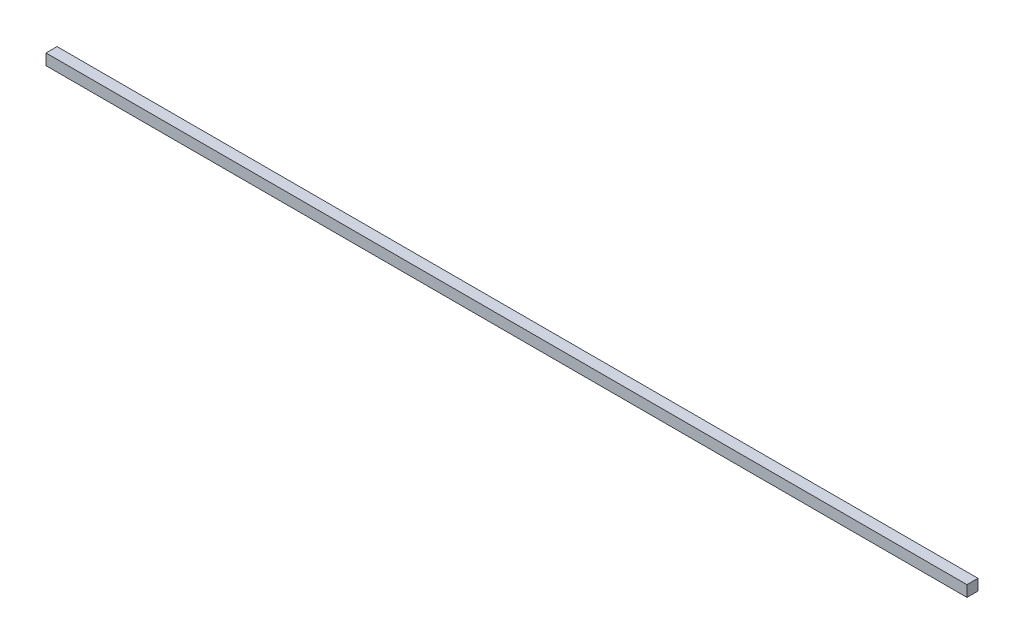
ISO-10303-21;
HEADER;
FILE_DESCRIPTION(('STEP AP214'),'2;1');
FILE_NAME('part.step','',(''),(''),'','','');
FILE_SCHEMA(('AUTOMOTIVE_DESIGN { 1 0 10303 214 1 1 1 1 }'));
ENDSEC;
DATA;
#1=APPLICATION_CONTEXT('core data for automotive mechanical design processes');
#2=APPLICATION_PROTOCOL_DEFINITION('international standard','automotive_design',2000,#1);
#3=PRODUCT_CONTEXT('',#1,'mechanical');
#4=PRODUCT('Part','Part','',(#3));
#5=PRODUCT_RELATED_PRODUCT_CATEGORY('part','',(#4));
#6=PRODUCT_DEFINITION_FORMATION('','',#4);
#7=PRODUCT_DEFINITION_CONTEXT('part definition',#1,'design');
#8=PRODUCT_DEFINITION('design','',#6,#7);
#9=PRODUCT_DEFINITION_SHAPE('','',#8);
#10=(LENGTH_UNIT() NAMED_UNIT(*) SI_UNIT(.MILLI.,.METRE.));
#11=(NAMED_UNIT(*) PLANE_ANGLE_UNIT() SI_UNIT($,.RADIAN.));
#12=(NAMED_UNIT(*) SI_UNIT($,.STERADIAN.) SOLID_ANGLE_UNIT());
#13=UNCERTAINTY_MEASURE_WITH_UNIT(LENGTH_MEASURE(1.E-05),#10,'distance_accuracy_value','');
#14=(GEOMETRIC_REPRESENTATION_CONTEXT(3) GLOBAL_UNCERTAINTY_ASSIGNED_CONTEXT((#13)) GLOBAL_UNIT_ASSIGNED_CONTEXT((#10,
#11,#12)) REPRESENTATION_CONTEXT('',''));
#15=CARTESIAN_POINT('',(0.,0.,0.));
#16=DIRECTION('',(0.,0.,1.));
#17=DIRECTION('',(1.,0.,0.));
#18=AXIS2_PLACEMENT_3D('',#15,#16,#17);
#19=CARTESIAN_POINT('',(2502.,15.,-15.));
#20=DIRECTION('',(0.,0.,1.));
#21=DIRECTION('',(1.,0.,0.));
#22=AXIS2_PLACEMENT_3D('',#19,#20,#21);
#23=PLANE('',#22);
#24=DIRECTION('',(0.,1.,0.));
#25=VECTOR('',#24,1.);
#26=CARTESIAN_POINT('',(0.,15.,-15.));
#27=LINE('',#26,#25);
#28=CARTESIAN_POINT('',(0.,-15.,-15.));
#29=VERTEX_POINT('',#28);
#30=CARTESIAN_POINT('',(0.,15.,-15.));
#31=VERTEX_POINT('',#30);
#32=EDGE_CURVE('E107',#29,#31,#27,.T.);
#33=ORIENTED_EDGE('',*,*,#32,.T.);
#34=DIRECTION('',(-1.,0.,0.));
#35=VECTOR('',#34,1.);
#36=CARTESIAN_POINT('',(2502.,15.,-15.));
#37=LINE('',#36,#35);
#38=CARTESIAN_POINT('',(2502.,15.,-15.));
#39=VERTEX_POINT('',#38);
#40=EDGE_CURVE('E11',#39,#31,#37,.T.);
#41=ORIENTED_EDGE('',*,*,#40,.F.);
#42=DIRECTION('',(0.,1.,0.));
#43=VECTOR('',#42,1.);
#44=CARTESIAN_POINT('',(2502.,15.,-15.));
#45=LINE('',#44,#43);
#46=CARTESIAN_POINT('',(2502.,-15.,-15.));
#47=VERTEX_POINT('',#46);
#48=EDGE_CURVE('E91',#47,#39,#45,.T.);
#49=ORIENTED_EDGE('',*,*,#48,.F.);
#50=DIRECTION('',(-1.,0.,0.));
#51=VECTOR('',#50,1.);
#52=CARTESIAN_POINT('',(2502.,-15.,-15.));
#53=LINE('',#52,#51);
#54=EDGE_CURVE('E103',#47,#29,#53,.T.);
#55=ORIENTED_EDGE('',*,*,#54,.T.);
#56=EDGE_LOOP('',(#33,#41,#49,#55));
#57=FACE_BOUND('',#56,.T.);
#58=ADVANCED_FACE('F39',(#57),#23,.F.);
#59=CARTESIAN_POINT('',(2502.,15.,15.));
#60=DIRECTION('',(0.,-1.,0.));
#61=DIRECTION('',(0.,0.,-1.));
#62=AXIS2_PLACEMENT_3D('',#59,#60,#61);
#63=PLANE('',#62);
#64=DIRECTION('',(0.,0.,1.));
#65=VECTOR('',#64,1.);
#66=CARTESIAN_POINT('',(0.,15.,15.));
#67=LINE('',#66,#65);
#68=CARTESIAN_POINT('',(0.,15.,15.));
#69=VERTEX_POINT('',#68);
#70=EDGE_CURVE('E96',#31,#69,#67,.T.);
#71=ORIENTED_EDGE('',*,*,#70,.T.);
#72=DIRECTION('',(-1.,0.,0.));
#73=VECTOR('',#72,1.);
#74=CARTESIAN_POINT('',(2502.,15.,15.));
#75=LINE('',#74,#73);
#76=CARTESIAN_POINT('',(2502.,15.,15.));
#77=VERTEX_POINT('',#76);
#78=EDGE_CURVE('E48',#77,#69,#75,.T.);
#79=ORIENTED_EDGE('',*,*,#78,.F.);
#80=DIRECTION('',(0.,0.,1.));
#81=VECTOR('',#80,1.);
#82=CARTESIAN_POINT('',(2502.,15.,15.));
#83=LINE('',#82,#81);
#84=EDGE_CURVE('E86',#39,#77,#83,.T.);
#85=ORIENTED_EDGE('',*,*,#84,.F.);
#86=ORIENTED_EDGE('',*,*,#40,.T.);
#87=EDGE_LOOP('',(#71,#79,#85,#86));
#88=FACE_BOUND('',#87,.T.);
#89=ADVANCED_FACE('F95',(#88),#63,.F.);
#90=CARTESIAN_POINT('',(2502.,15.,15.));
#91=DIRECTION('',(0.,0.,-1.));
#92=DIRECTION('',(-1.,0.,0.));
#93=AXIS2_PLACEMENT_3D('',#90,#91,#92);
#94=PLANE('',#93);
#95=DIRECTION('',(0.,-1.,0.));
#96=VECTOR('',#95,1.);
#97=CARTESIAN_POINT('',(0.,15.,15.));
#98=LINE('',#97,#96);
#99=CARTESIAN_POINT('',(0.,-15.,15.));
#100=VERTEX_POINT('',#99);
#101=EDGE_CURVE('E73',#69,#100,#98,.T.);
#102=ORIENTED_EDGE('',*,*,#101,.T.);
#103=DIRECTION('',(-1.,0.,0.));
#104=VECTOR('',#103,1.);
#105=CARTESIAN_POINT('',(2502.,-15.,15.));
#106=LINE('',#105,#104);
#107=CARTESIAN_POINT('',(2502.,-15.,15.));
#108=VERTEX_POINT('',#107);
#109=EDGE_CURVE('E98',#108,#100,#106,.T.);
#110=ORIENTED_EDGE('',*,*,#109,.F.);
#111=DIRECTION('',(0.,-1.,0.));
#112=VECTOR('',#111,1.);
#113=CARTESIAN_POINT('',(2502.,15.,15.));
#114=LINE('',#113,#112);
#115=EDGE_CURVE('E89',#77,#108,#114,.T.);
#116=ORIENTED_EDGE('',*,*,#115,.F.);
#117=ORIENTED_EDGE('',*,*,#78,.T.);
#118=EDGE_LOOP('',(#102,#110,#116,#117));
#119=FACE_BOUND('',#118,.T.);
#120=ADVANCED_FACE('F99',(#119),#94,.F.);
#121=CARTESIAN_POINT('',(2502.,-15.,15.));
#122=DIRECTION('',(0.,1.,0.));
#123=DIRECTION('',(0.,0.,1.));
#124=AXIS2_PLACEMENT_3D('',#121,#122,#123);
#125=PLANE('',#124);
#126=DIRECTION('',(0.,0.,-1.));
#127=VECTOR('',#126,1.);
#128=CARTESIAN_POINT('',(0.,-15.,15.));
#129=LINE('',#128,#127);
#130=EDGE_CURVE('E79',#100,#29,#129,.T.);
#131=ORIENTED_EDGE('',*,*,#130,.T.);
#132=ORIENTED_EDGE('',*,*,#54,.F.);
#133=DIRECTION('',(0.,0.,-1.));
#134=VECTOR('',#133,1.);
#135=CARTESIAN_POINT('',(2502.,-15.,15.));
#136=LINE('',#135,#134);
#137=EDGE_CURVE('E56',#108,#47,#136,.T.);
#138=ORIENTED_EDGE('',*,*,#137,.F.);
#139=ORIENTED_EDGE('',*,*,#109,.T.);
#140=EDGE_LOOP('',(#131,#132,#138,#139));
#141=FACE_BOUND('',#140,.T.);
#142=ADVANCED_FACE('F120',(#141),#125,.F.);
#143=CARTESIAN_POINT('',(2502.,0.,0.));
#144=DIRECTION('',(1.,0.,0.));
#145=DIRECTION('',(0.,0.,-1.));
#146=AXIS2_PLACEMENT_3D('',#143,#144,#145);
#147=PLANE('',#146);
#148=ORIENTED_EDGE('',*,*,#48,.T.);
#149=ORIENTED_EDGE('',*,*,#84,.T.);
#150=ORIENTED_EDGE('',*,*,#115,.T.);
#151=ORIENTED_EDGE('',*,*,#137,.T.);
#152=EDGE_LOOP('',(#148,#149,#150,#151));
#153=FACE_BOUND('',#152,.T.);
#154=ADVANCED_FACE('F87',(#153),#147,.T.);
#155=CARTESIAN_POINT('',(0.,0.,0.));
#156=DIRECTION('',(1.,0.,0.));
#157=DIRECTION('',(0.,0.,-1.));
#158=AXIS2_PLACEMENT_3D('',#155,#156,#157);
#159=PLANE('',#158);
#160=ORIENTED_EDGE('',*,*,#32,.F.);
#161=ORIENTED_EDGE('',*,*,#130,.F.);
#162=ORIENTED_EDGE('',*,*,#101,.F.);
#163=ORIENTED_EDGE('',*,*,#70,.F.);
#164=EDGE_LOOP('',(#160,#161,#162,#163));
#165=FACE_BOUND('',#164,.T.);
#166=ADVANCED_FACE('F123',(#165),#159,.F.);
#167=CLOSED_SHELL('',(#58,#89,#120,#142,#154,#166));
#168=MANIFOLD_SOLID_BREP('B2',#167);
#169=ADVANCED_BREP_SHAPE_REPRESENTATION('',(#18,#168),#14);
#170=SHAPE_DEFINITION_REPRESENTATION(#9,#169);
ENDSEC;
END-ISO-10303-21;
